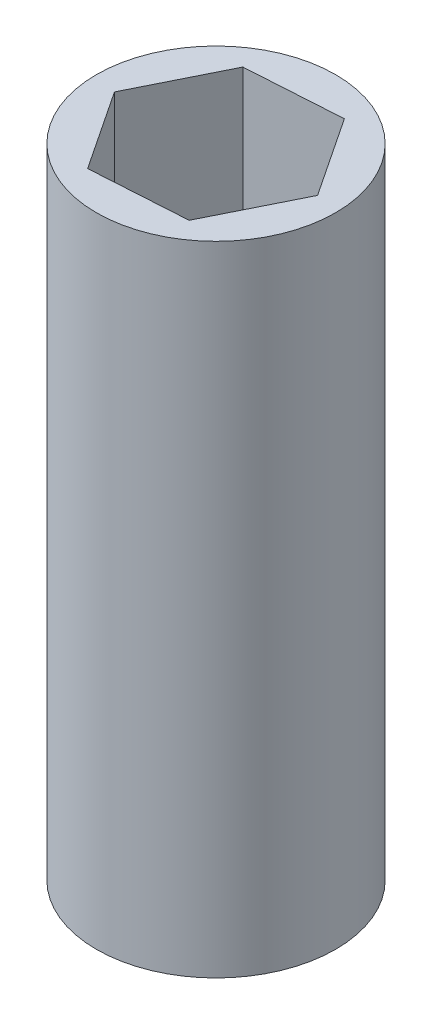
ISO-10303-21;
HEADER;
FILE_DESCRIPTION(('STEP AP214'),'2;1');
FILE_NAME('part.step','',(''),(''),'','','');
FILE_SCHEMA(('AUTOMOTIVE_DESIGN { 1 0 10303 214 1 1 1 1 }'));
ENDSEC;
DATA;
#1=APPLICATION_CONTEXT('core data for automotive mechanical design processes');
#2=APPLICATION_PROTOCOL_DEFINITION('international standard','automotive_design',2000,#1);
#3=PRODUCT_CONTEXT('',#1,'mechanical');
#4=PRODUCT('Part','Part','',(#3));
#5=PRODUCT_RELATED_PRODUCT_CATEGORY('part','',(#4));
#6=PRODUCT_DEFINITION_FORMATION('','',#4);
#7=PRODUCT_DEFINITION_CONTEXT('part definition',#1,'design');
#8=PRODUCT_DEFINITION('design','',#6,#7);
#9=PRODUCT_DEFINITION_SHAPE('','',#8);
#10=(LENGTH_UNIT() NAMED_UNIT(*) SI_UNIT(.MILLI.,.METRE.));
#11=(NAMED_UNIT(*) PLANE_ANGLE_UNIT() SI_UNIT($,.RADIAN.));
#12=(NAMED_UNIT(*) SI_UNIT($,.STERADIAN.) SOLID_ANGLE_UNIT());
#13=UNCERTAINTY_MEASURE_WITH_UNIT(LENGTH_MEASURE(1.E-05),#10,'distance_accuracy_value','');
#14=(GEOMETRIC_REPRESENTATION_CONTEXT(3) GLOBAL_UNCERTAINTY_ASSIGNED_CONTEXT((#13)) GLOBAL_UNIT_ASSIGNED_CONTEXT((#10,
#11,#12)) REPRESENTATION_CONTEXT('',''));
#15=CARTESIAN_POINT('',(0.,0.,0.));
#16=DIRECTION('',(0.,0.,1.));
#17=DIRECTION('',(1.,0.,0.));
#18=AXIS2_PLACEMENT_3D('',#15,#16,#17);
#19=CARTESIAN_POINT('',(0.,50.8,0.));
#20=DIRECTION('',(0.,1.,0.));
#21=DIRECTION('',(0.,0.,1.));
#22=AXIS2_PLACEMENT_3D('',#19,#20,#21);
#23=PLANE('',#22);
#24=CARTESIAN_POINT('',(0.,50.8,0.));
#25=DIRECTION('',(0.,1.,0.));
#26=DIRECTION('',(0.,0.,1.));
#27=AXIS2_PLACEMENT_3D('',#24,#25,#26);
#28=CIRCLE('',#27,9.525);
#29=CARTESIAN_POINT('',(0.,50.8,9.525));
#30=VERTEX_POINT('',#29);
#31=EDGE_CURVE('E11',#30,#30,#28,.T.);
#32=ORIENTED_EDGE('',*,*,#31,.T.);
#33=EDGE_LOOP('',(#32));
#34=FACE_BOUND('',#33,.T.);
#35=DIRECTION('',(-0.998051336105039,0.,0.0623981610221579));
#36=VECTOR('',#35,1.);
#37=CARTESIAN_POINT('',(3.39331381537098,50.8,-6.82904405343426));
#38=LINE('',#37,#36);
#39=CARTESIAN_POINT('',(3.39331381537098,50.8,-6.82904405343426));
#40=VERTEX_POINT('',#39);
#41=CARTESIAN_POINT('',(-4.21746872615163,50.8,-6.35321799384109));
#42=VERTEX_POINT('',#41);
#43=EDGE_CURVE('E98',#40,#42,#38,.T.);
#44=ORIENTED_EDGE('',*,*,#43,.F.);
#45=DIRECTION('',(-0.55306406064714,0.,-0.833138730836886));
#46=VECTOR('',#45,1.);
#47=CARTESIAN_POINT('',(7.61078254152261,50.8,-0.475826059593166));
#48=LINE('',#47,#46);
#49=CARTESIAN_POINT('',(7.61078254152261,50.8,-0.475826059593166));
#50=VERTEX_POINT('',#49);
#51=EDGE_CURVE('E90',#50,#40,#48,.T.);
#52=ORIENTED_EDGE('',*,*,#51,.F.);
#53=DIRECTION('',(0.444987275457899,0.,-0.895536891859043));
#54=VECTOR('',#53,1.);
#55=CARTESIAN_POINT('',(4.21746872615163,50.8,6.3532179938411));
#56=LINE('',#55,#54);
#57=CARTESIAN_POINT('',(4.21746872615163,50.8,6.3532179938411));
#58=VERTEX_POINT('',#57);
#59=EDGE_CURVE('E118',#58,#50,#56,.T.);
#60=ORIENTED_EDGE('',*,*,#59,.F.);
#61=DIRECTION('',(0.998051336105039,0.,-0.0623981610221575));
#62=VECTOR('',#61,1.);
#63=CARTESIAN_POINT('',(-3.39331381537097,50.8,6.82904405343426));
#64=LINE('',#63,#62);
#65=CARTESIAN_POINT('',(-3.39331381537097,50.8,6.82904405343426));
#66=VERTEX_POINT('',#65);
#67=EDGE_CURVE('E116',#66,#58,#64,.T.);
#68=ORIENTED_EDGE('',*,*,#67,.F.);
#69=DIRECTION('',(0.55306406064714,0.,0.833138730836885));
#70=VECTOR('',#69,1.);
#71=CARTESIAN_POINT('',(-7.61078254152261,50.8,0.475826059593167));
#72=LINE('',#71,#70);
#73=CARTESIAN_POINT('',(-7.61078254152261,50.8,0.475826059593167));
#74=VERTEX_POINT('',#73);
#75=EDGE_CURVE('E112',#74,#66,#72,.T.);
#76=ORIENTED_EDGE('',*,*,#75,.F.);
#77=DIRECTION('',(-0.444987275457898,0.,0.895536891859044));
#78=VECTOR('',#77,1.);
#79=CARTESIAN_POINT('',(-4.21746872615163,50.8,-6.35321799384109));
#80=LINE('',#79,#78);
#81=EDGE_CURVE('E110',#42,#74,#80,.T.);
#82=ORIENTED_EDGE('',*,*,#81,.F.);
#83=EDGE_LOOP('',(#44,#52,#60,#68,#76,#82));
#84=FACE_BOUND('',#83,.T.);
#85=ADVANCED_FACE('F37',(#34,#84),#23,.T.);
#86=CARTESIAN_POINT('',(0.,0.,0.));
#87=DIRECTION('',(0.,1.,0.));
#88=DIRECTION('',(0.,0.,1.));
#89=AXIS2_PLACEMENT_3D('',#86,#87,#88);
#90=PLANE('',#89);
#91=CARTESIAN_POINT('',(0.,0.,0.));
#92=DIRECTION('',(0.,1.,0.));
#93=DIRECTION('',(0.,0.,1.));
#94=AXIS2_PLACEMENT_3D('',#91,#92,#93);
#95=CIRCLE('',#94,9.525);
#96=CARTESIAN_POINT('',(0.,0.,9.525));
#97=VERTEX_POINT('',#96);
#98=EDGE_CURVE('E41',#97,#97,#95,.T.);
#99=ORIENTED_EDGE('',*,*,#98,.F.);
#100=EDGE_LOOP('',(#99));
#101=FACE_BOUND('',#100,.T.);
#102=DIRECTION('',(-0.55306406064714,0.,-0.833138730836886));
#103=VECTOR('',#102,1.);
#104=CARTESIAN_POINT('',(7.61078254152261,0.,-0.475826059593166));
#105=LINE('',#104,#103);
#106=CARTESIAN_POINT('',(7.61078254152261,0.,-0.475826059593166));
#107=VERTEX_POINT('',#106);
#108=CARTESIAN_POINT('',(3.39331381537098,0.,-6.82904405343426));
#109=VERTEX_POINT('',#108);
#110=EDGE_CURVE('E60',#107,#109,#105,.T.);
#111=ORIENTED_EDGE('',*,*,#110,.T.);
#112=DIRECTION('',(-0.998051336105039,0.,0.0623981610221579));
#113=VECTOR('',#112,1.);
#114=CARTESIAN_POINT('',(3.39331381537098,0.,-6.82904405343426));
#115=LINE('',#114,#113);
#116=CARTESIAN_POINT('',(-4.21746872615163,0.,-6.35321799384109));
#117=VERTEX_POINT('',#116);
#118=EDGE_CURVE('E105',#109,#117,#115,.T.);
#119=ORIENTED_EDGE('',*,*,#118,.T.);
#120=DIRECTION('',(-0.444987275457898,0.,0.895536891859044));
#121=VECTOR('',#120,1.);
#122=CARTESIAN_POINT('',(-4.21746872615163,0.,-6.35321799384109));
#123=LINE('',#122,#121);
#124=CARTESIAN_POINT('',(-7.61078254152261,0.,0.475826059593167));
#125=VERTEX_POINT('',#124);
#126=EDGE_CURVE('E122',#117,#125,#123,.T.);
#127=ORIENTED_EDGE('',*,*,#126,.T.);
#128=DIRECTION('',(0.55306406064714,0.,0.833138730836885));
#129=VECTOR('',#128,1.);
#130=CARTESIAN_POINT('',(-7.61078254152261,0.,0.475826059593167));
#131=LINE('',#130,#129);
#132=CARTESIAN_POINT('',(-3.39331381537097,0.,6.82904405343426));
#133=VERTEX_POINT('',#132);
#134=EDGE_CURVE('E125',#125,#133,#131,.T.);
#135=ORIENTED_EDGE('',*,*,#134,.T.);
#136=DIRECTION('',(0.998051336105039,0.,-0.0623981610221575));
#137=VECTOR('',#136,1.);
#138=CARTESIAN_POINT('',(-3.39331381537097,0.,6.82904405343426));
#139=LINE('',#138,#137);
#140=CARTESIAN_POINT('',(4.21746872615163,0.,6.3532179938411));
#141=VERTEX_POINT('',#140);
#142=EDGE_CURVE('E128',#133,#141,#139,.T.);
#143=ORIENTED_EDGE('',*,*,#142,.T.);
#144=DIRECTION('',(0.444987275457899,0.,-0.895536891859043));
#145=VECTOR('',#144,1.);
#146=CARTESIAN_POINT('',(4.21746872615163,0.,6.3532179938411));
#147=LINE('',#146,#145);
#148=EDGE_CURVE('E99',#141,#107,#147,.T.);
#149=ORIENTED_EDGE('',*,*,#148,.T.);
#150=EDGE_LOOP('',(#111,#119,#127,#135,#143,#149));
#151=FACE_BOUND('',#150,.T.);
#152=ADVANCED_FACE('F145',(#101,#151),#90,.F.);
#153=CARTESIAN_POINT('',(0.,50.8,0.));
#154=DIRECTION('',(0.,-1.,0.));
#155=DIRECTION('',(0.,0.,-1.));
#156=AXIS2_PLACEMENT_3D('',#153,#154,#155);
#157=CYLINDRICAL_SURFACE('',#156,9.525);
#158=ORIENTED_EDGE('',*,*,#31,.F.);
#159=EDGE_LOOP('',(#158));
#160=FACE_BOUND('',#159,.T.);
#161=ORIENTED_EDGE('',*,*,#98,.T.);
#162=EDGE_LOOP('',(#161));
#163=FACE_BOUND('',#162,.T.);
#164=ADVANCED_FACE('F39',(#160,#163),#157,.T.);
#165=CARTESIAN_POINT('',(7.61078254152261,50.8,-0.475826059593166));
#166=DIRECTION('',(-0.833138730836886,0.,0.55306406064714));
#167=DIRECTION('',(0.55306406064714,0.,0.833138730836886));
#168=AXIS2_PLACEMENT_3D('',#165,#166,#167);
#169=PLANE('',#168);
#170=ORIENTED_EDGE('',*,*,#110,.F.);
#171=DIRECTION('',(0.,-1.,0.));
#172=VECTOR('',#171,1.);
#173=CARTESIAN_POINT('',(7.61078254152261,50.8,-0.475826059593166));
#174=LINE('',#173,#172);
#175=EDGE_CURVE('E94',#50,#107,#174,.T.);
#176=ORIENTED_EDGE('',*,*,#175,.F.);
#177=ORIENTED_EDGE('',*,*,#51,.T.);
#178=DIRECTION('',(0.,-1.,0.));
#179=VECTOR('',#178,1.);
#180=CARTESIAN_POINT('',(3.39331381537098,50.8,-6.82904405343426));
#181=LINE('',#180,#179);
#182=EDGE_CURVE('E93',#40,#109,#181,.T.);
#183=ORIENTED_EDGE('',*,*,#182,.T.);
#184=EDGE_LOOP('',(#170,#176,#177,#183));
#185=FACE_BOUND('',#184,.T.);
#186=ADVANCED_FACE('F92',(#185),#169,.T.);
#187=CARTESIAN_POINT('',(3.39331381537098,50.8,-6.82904405343426));
#188=DIRECTION('',(0.0623981610221579,0.,0.998051336105039));
#189=DIRECTION('',(0.998051336105039,0.,-0.0623981610221579));
#190=AXIS2_PLACEMENT_3D('',#187,#188,#189);
#191=PLANE('',#190);
#192=ORIENTED_EDGE('',*,*,#118,.F.);
#193=ORIENTED_EDGE('',*,*,#182,.F.);
#194=ORIENTED_EDGE('',*,*,#43,.T.);
#195=DIRECTION('',(0.,-1.,0.));
#196=VECTOR('',#195,1.);
#197=CARTESIAN_POINT('',(-4.21746872615163,50.8,-6.35321799384109));
#198=LINE('',#197,#196);
#199=EDGE_CURVE('E106',#42,#117,#198,.T.);
#200=ORIENTED_EDGE('',*,*,#199,.T.);
#201=EDGE_LOOP('',(#192,#193,#194,#200));
#202=FACE_BOUND('',#201,.T.);
#203=ADVANCED_FACE('F102',(#202),#191,.T.);
#204=CARTESIAN_POINT('',(-4.21746872615163,50.8,-6.35321799384109));
#205=DIRECTION('',(0.895536891859044,0.,0.444987275457898));
#206=DIRECTION('',(0.444987275457898,0.,-0.895536891859044));
#207=AXIS2_PLACEMENT_3D('',#204,#205,#206);
#208=PLANE('',#207);
#209=ORIENTED_EDGE('',*,*,#126,.F.);
#210=ORIENTED_EDGE('',*,*,#199,.F.);
#211=ORIENTED_EDGE('',*,*,#81,.T.);
#212=DIRECTION('',(0.,-1.,0.));
#213=VECTOR('',#212,1.);
#214=CARTESIAN_POINT('',(-7.61078254152261,50.8,0.475826059593167));
#215=LINE('',#214,#213);
#216=EDGE_CURVE('E137',#74,#125,#215,.T.);
#217=ORIENTED_EDGE('',*,*,#216,.T.);
#218=EDGE_LOOP('',(#209,#210,#211,#217));
#219=FACE_BOUND('',#218,.T.);
#220=ADVANCED_FACE('F141',(#219),#208,.T.);
#221=CARTESIAN_POINT('',(-7.61078254152261,50.8,0.475826059593167));
#222=DIRECTION('',(0.833138730836885,0.,-0.55306406064714));
#223=DIRECTION('',(-0.55306406064714,0.,-0.833138730836886));
#224=AXIS2_PLACEMENT_3D('',#221,#222,#223);
#225=PLANE('',#224);
#226=ORIENTED_EDGE('',*,*,#134,.F.);
#227=ORIENTED_EDGE('',*,*,#216,.F.);
#228=ORIENTED_EDGE('',*,*,#75,.T.);
#229=DIRECTION('',(0.,-1.,0.));
#230=VECTOR('',#229,1.);
#231=CARTESIAN_POINT('',(-3.39331381537097,50.8,6.82904405343426));
#232=LINE('',#231,#230);
#233=EDGE_CURVE('E135',#66,#133,#232,.T.);
#234=ORIENTED_EDGE('',*,*,#233,.T.);
#235=EDGE_LOOP('',(#226,#227,#228,#234));
#236=FACE_BOUND('',#235,.T.);
#237=ADVANCED_FACE('F153',(#236),#225,.T.);
#238=CARTESIAN_POINT('',(-3.39331381537097,50.8,6.82904405343426));
#239=DIRECTION('',(-0.0623981610221575,0.,-0.998051336105039));
#240=DIRECTION('',(-0.998051336105039,0.,0.0623981610221575));
#241=AXIS2_PLACEMENT_3D('',#238,#239,#240);
#242=PLANE('',#241);
#243=ORIENTED_EDGE('',*,*,#142,.F.);
#244=ORIENTED_EDGE('',*,*,#233,.F.);
#245=ORIENTED_EDGE('',*,*,#67,.T.);
#246=DIRECTION('',(0.,-1.,0.));
#247=VECTOR('',#246,1.);
#248=CARTESIAN_POINT('',(4.21746872615163,50.8,6.3532179938411));
#249=LINE('',#248,#247);
#250=EDGE_CURVE('E52',#58,#141,#249,.T.);
#251=ORIENTED_EDGE('',*,*,#250,.T.);
#252=EDGE_LOOP('',(#243,#244,#245,#251));
#253=FACE_BOUND('',#252,.T.);
#254=ADVANCED_FACE('F151',(#253),#242,.T.);
#255=CARTESIAN_POINT('',(4.21746872615163,50.8,6.3532179938411));
#256=DIRECTION('',(-0.895536891859043,0.,-0.444987275457899));
#257=DIRECTION('',(-0.444987275457899,0.,0.895536891859044));
#258=AXIS2_PLACEMENT_3D('',#255,#256,#257);
#259=PLANE('',#258);
#260=ORIENTED_EDGE('',*,*,#148,.F.);
#261=ORIENTED_EDGE('',*,*,#250,.F.);
#262=ORIENTED_EDGE('',*,*,#59,.T.);
#263=ORIENTED_EDGE('',*,*,#175,.T.);
#264=EDGE_LOOP('',(#260,#261,#262,#263));
#265=FACE_BOUND('',#264,.T.);
#266=ADVANCED_FACE('F147',(#265),#259,.T.);
#267=CLOSED_SHELL('',(#85,#152,#164,#186,#203,#220,#237,#254,#266));
#268=MANIFOLD_SOLID_BREP('B2',#267);
#269=ADVANCED_BREP_SHAPE_REPRESENTATION('',(#18,#268),#14);
#270=SHAPE_DEFINITION_REPRESENTATION(#9,#269);
ENDSEC;
END-ISO-10303-21;
